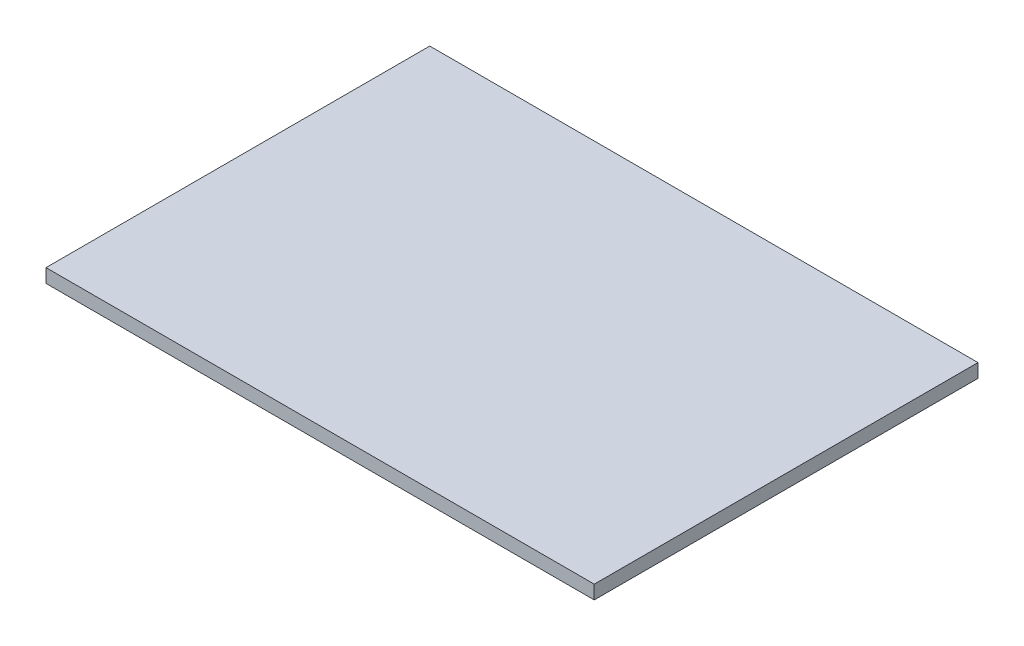
ISO-10303-21;
HEADER;
FILE_DESCRIPTION(('STEP AP214'),'2;1');
FILE_NAME('part.step','',(''),(''),'','','');
FILE_SCHEMA(('AUTOMOTIVE_DESIGN { 1 0 10303 214 1 1 1 1 }'));
ENDSEC;
DATA;
#1=APPLICATION_CONTEXT('core data for automotive mechanical design processes');
#2=APPLICATION_PROTOCOL_DEFINITION('international standard','automotive_design',2000,#1);
#3=PRODUCT_CONTEXT('',#1,'mechanical');
#4=PRODUCT('Part','Part','',(#3));
#5=PRODUCT_RELATED_PRODUCT_CATEGORY('part','',(#4));
#6=PRODUCT_DEFINITION_FORMATION('','',#4);
#7=PRODUCT_DEFINITION_CONTEXT('part definition',#1,'design');
#8=PRODUCT_DEFINITION('design','',#6,#7);
#9=PRODUCT_DEFINITION_SHAPE('','',#8);
#10=(LENGTH_UNIT() NAMED_UNIT(*) SI_UNIT(.MILLI.,.METRE.));
#11=(NAMED_UNIT(*) PLANE_ANGLE_UNIT() SI_UNIT($,.RADIAN.));
#12=(NAMED_UNIT(*) SI_UNIT($,.STERADIAN.) SOLID_ANGLE_UNIT());
#13=UNCERTAINTY_MEASURE_WITH_UNIT(LENGTH_MEASURE(1.E-05),#10,'distance_accuracy_value','');
#14=(GEOMETRIC_REPRESENTATION_CONTEXT(3) GLOBAL_UNCERTAINTY_ASSIGNED_CONTEXT((#13)) GLOBAL_UNIT_ASSIGNED_CONTEXT((#10,
#11,#12)) REPRESENTATION_CONTEXT('',''));
#15=CARTESIAN_POINT('',(0.,0.,0.));
#16=DIRECTION('',(0.,0.,1.));
#17=DIRECTION('',(1.,0.,0.));
#18=AXIS2_PLACEMENT_3D('',#15,#16,#17);
#19=CARTESIAN_POINT('',(0.,5.,0.));
#20=DIRECTION('',(1.,0.,0.));
#21=DIRECTION('',(0.,0.,-1.));
#22=AXIS2_PLACEMENT_3D('',#19,#20,#21);
#23=PLANE('',#22);
#24=DIRECTION('',(0.,0.,1.));
#25=VECTOR('',#24,1.);
#26=CARTESIAN_POINT('',(0.,0.,0.));
#27=LINE('',#26,#25);
#28=CARTESIAN_POINT('',(0.,0.,-140.));
#29=VERTEX_POINT('',#28);
#30=CARTESIAN_POINT('',(0.,0.,0.));
#31=VERTEX_POINT('',#30);
#32=EDGE_CURVE('E107',#29,#31,#27,.T.);
#33=ORIENTED_EDGE('',*,*,#32,.T.);
#34=DIRECTION('',(0.,-1.,0.));
#35=VECTOR('',#34,1.);
#36=CARTESIAN_POINT('',(0.,5.,0.));
#37=LINE('',#36,#35);
#38=CARTESIAN_POINT('',(0.,5.,0.));
#39=VERTEX_POINT('',#38);
#40=EDGE_CURVE('E11',#39,#31,#37,.T.);
#41=ORIENTED_EDGE('',*,*,#40,.F.);
#42=DIRECTION('',(0.,0.,1.));
#43=VECTOR('',#42,1.);
#44=CARTESIAN_POINT('',(0.,5.,0.));
#45=LINE('',#44,#43);
#46=CARTESIAN_POINT('',(0.,5.,-140.));
#47=VERTEX_POINT('',#46);
#48=EDGE_CURVE('E91',#47,#39,#45,.T.);
#49=ORIENTED_EDGE('',*,*,#48,.F.);
#50=DIRECTION('',(0.,-1.,0.));
#51=VECTOR('',#50,1.);
#52=CARTESIAN_POINT('',(0.,5.,-140.));
#53=LINE('',#52,#51);
#54=EDGE_CURVE('E103',#47,#29,#53,.T.);
#55=ORIENTED_EDGE('',*,*,#54,.T.);
#56=EDGE_LOOP('',(#33,#41,#49,#55));
#57=FACE_BOUND('',#56,.T.);
#58=ADVANCED_FACE('F39',(#57),#23,.F.);
#59=CARTESIAN_POINT('',(0.,5.,0.));
#60=DIRECTION('',(0.,0.,-1.));
#61=DIRECTION('',(-1.,0.,0.));
#62=AXIS2_PLACEMENT_3D('',#59,#60,#61);
#63=PLANE('',#62);
#64=DIRECTION('',(1.,0.,0.));
#65=VECTOR('',#64,1.);
#66=CARTESIAN_POINT('',(0.,0.,0.));
#67=LINE('',#66,#65);
#68=CARTESIAN_POINT('',(200.,0.,0.));
#69=VERTEX_POINT('',#68);
#70=EDGE_CURVE('E96',#31,#69,#67,.T.);
#71=ORIENTED_EDGE('',*,*,#70,.T.);
#72=DIRECTION('',(0.,-1.,0.));
#73=VECTOR('',#72,1.);
#74=CARTESIAN_POINT('',(200.,5.,0.));
#75=LINE('',#74,#73);
#76=CARTESIAN_POINT('',(200.,5.,0.));
#77=VERTEX_POINT('',#76);
#78=EDGE_CURVE('E48',#77,#69,#75,.T.);
#79=ORIENTED_EDGE('',*,*,#78,.F.);
#80=DIRECTION('',(1.,0.,0.));
#81=VECTOR('',#80,1.);
#82=CARTESIAN_POINT('',(0.,5.,0.));
#83=LINE('',#82,#81);
#84=EDGE_CURVE('E86',#39,#77,#83,.T.);
#85=ORIENTED_EDGE('',*,*,#84,.F.);
#86=ORIENTED_EDGE('',*,*,#40,.T.);
#87=EDGE_LOOP('',(#71,#79,#85,#86));
#88=FACE_BOUND('',#87,.T.);
#89=ADVANCED_FACE('F95',(#88),#63,.F.);
#90=CARTESIAN_POINT('',(200.,5.,0.));
#91=DIRECTION('',(-1.,0.,0.));
#92=DIRECTION('',(0.,0.,1.));
#93=AXIS2_PLACEMENT_3D('',#90,#91,#92);
#94=PLANE('',#93);
#95=DIRECTION('',(0.,0.,-1.));
#96=VECTOR('',#95,1.);
#97=CARTESIAN_POINT('',(200.,0.,0.));
#98=LINE('',#97,#96);
#99=CARTESIAN_POINT('',(200.,0.,-140.));
#100=VERTEX_POINT('',#99);
#101=EDGE_CURVE('E73',#69,#100,#98,.T.);
#102=ORIENTED_EDGE('',*,*,#101,.T.);
#103=DIRECTION('',(0.,-1.,0.));
#104=VECTOR('',#103,1.);
#105=CARTESIAN_POINT('',(200.,5.,-140.));
#106=LINE('',#105,#104);
#107=CARTESIAN_POINT('',(200.,5.,-140.));
#108=VERTEX_POINT('',#107);
#109=EDGE_CURVE('E98',#108,#100,#106,.T.);
#110=ORIENTED_EDGE('',*,*,#109,.F.);
#111=DIRECTION('',(0.,0.,-1.));
#112=VECTOR('',#111,1.);
#113=CARTESIAN_POINT('',(200.,5.,0.));
#114=LINE('',#113,#112);
#115=EDGE_CURVE('E89',#77,#108,#114,.T.);
#116=ORIENTED_EDGE('',*,*,#115,.F.);
#117=ORIENTED_EDGE('',*,*,#78,.T.);
#118=EDGE_LOOP('',(#102,#110,#116,#117));
#119=FACE_BOUND('',#118,.T.);
#120=ADVANCED_FACE('F99',(#119),#94,.F.);
#121=CARTESIAN_POINT('',(0.,5.,-140.));
#122=DIRECTION('',(0.,0.,1.));
#123=DIRECTION('',(1.,0.,0.));
#124=AXIS2_PLACEMENT_3D('',#121,#122,#123);
#125=PLANE('',#124);
#126=DIRECTION('',(-1.,0.,0.));
#127=VECTOR('',#126,1.);
#128=CARTESIAN_POINT('',(0.,0.,-140.));
#129=LINE('',#128,#127);
#130=EDGE_CURVE('E79',#100,#29,#129,.T.);
#131=ORIENTED_EDGE('',*,*,#130,.T.);
#132=ORIENTED_EDGE('',*,*,#54,.F.);
#133=DIRECTION('',(-1.,0.,0.));
#134=VECTOR('',#133,1.);
#135=CARTESIAN_POINT('',(0.,5.,-140.));
#136=LINE('',#135,#134);
#137=EDGE_CURVE('E56',#108,#47,#136,.T.);
#138=ORIENTED_EDGE('',*,*,#137,.F.);
#139=ORIENTED_EDGE('',*,*,#109,.T.);
#140=EDGE_LOOP('',(#131,#132,#138,#139));
#141=FACE_BOUND('',#140,.T.);
#142=ADVANCED_FACE('F120',(#141),#125,.F.);
#143=CARTESIAN_POINT('',(0.,5.,0.));
#144=DIRECTION('',(0.,-1.,0.));
#145=DIRECTION('',(0.,0.,-1.));
#146=AXIS2_PLACEMENT_3D('',#143,#144,#145);
#147=PLANE('',#146);
#148=ORIENTED_EDGE('',*,*,#48,.T.);
#149=ORIENTED_EDGE('',*,*,#84,.T.);
#150=ORIENTED_EDGE('',*,*,#115,.T.);
#151=ORIENTED_EDGE('',*,*,#137,.T.);
#152=EDGE_LOOP('',(#148,#149,#150,#151));
#153=FACE_BOUND('',#152,.T.);
#154=ADVANCED_FACE('F87',(#153),#147,.F.);
#155=CARTESIAN_POINT('',(0.,0.,0.));
#156=DIRECTION('',(0.,-1.,0.));
#157=DIRECTION('',(0.,0.,-1.));
#158=AXIS2_PLACEMENT_3D('',#155,#156,#157);
#159=PLANE('',#158);
#160=ORIENTED_EDGE('',*,*,#32,.F.);
#161=ORIENTED_EDGE('',*,*,#130,.F.);
#162=ORIENTED_EDGE('',*,*,#101,.F.);
#163=ORIENTED_EDGE('',*,*,#70,.F.);
#164=EDGE_LOOP('',(#160,#161,#162,#163));
#165=FACE_BOUND('',#164,.T.);
#166=ADVANCED_FACE('F123',(#165),#159,.T.);
#167=CLOSED_SHELL('',(#58,#89,#120,#142,#154,#166));
#168=MANIFOLD_SOLID_BREP('B2',#167);
#169=ADVANCED_BREP_SHAPE_REPRESENTATION('',(#18,#168),#14);
#170=SHAPE_DEFINITION_REPRESENTATION(#9,#169);
ENDSEC;
END-ISO-10303-21;
